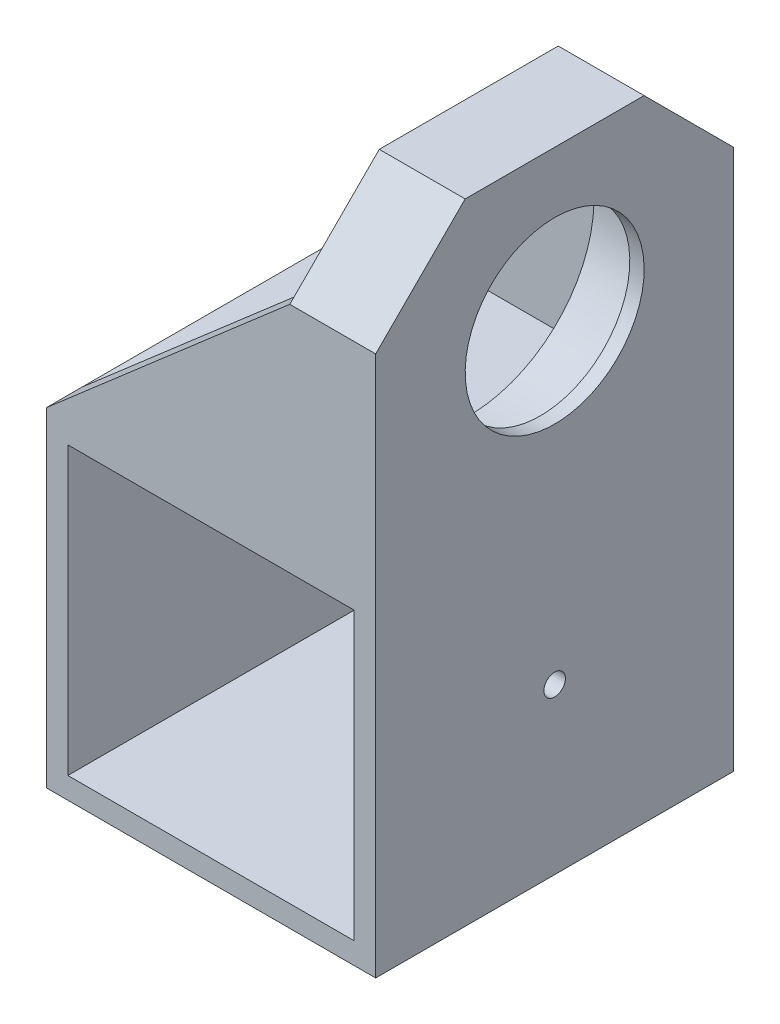
ISO-10303-21;
HEADER;
FILE_DESCRIPTION(('STEP AP214'),'2;1');
FILE_NAME('part.step','',(''),(''),'','','');
FILE_SCHEMA(('AUTOMOTIVE_DESIGN { 1 0 10303 214 1 1 1 1 }'));
ENDSEC;
DATA;
#1=APPLICATION_CONTEXT('core data for automotive mechanical design processes');
#2=APPLICATION_PROTOCOL_DEFINITION('international standard','automotive_design',2000,#1);
#3=PRODUCT_CONTEXT('',#1,'mechanical');
#4=PRODUCT('Part','Part','',(#3));
#5=PRODUCT_RELATED_PRODUCT_CATEGORY('part','',(#4));
#6=PRODUCT_DEFINITION_FORMATION('','',#4);
#7=PRODUCT_DEFINITION_CONTEXT('part definition',#1,'design');
#8=PRODUCT_DEFINITION('design','',#6,#7);
#9=PRODUCT_DEFINITION_SHAPE('','',#8);
#10=(LENGTH_UNIT() NAMED_UNIT(*) SI_UNIT(.MILLI.,.METRE.));
#11=(NAMED_UNIT(*) PLANE_ANGLE_UNIT() SI_UNIT($,.RADIAN.));
#12=(NAMED_UNIT(*) SI_UNIT($,.STERADIAN.) SOLID_ANGLE_UNIT());
#13=UNCERTAINTY_MEASURE_WITH_UNIT(LENGTH_MEASURE(1.E-05),#10,'distance_accuracy_value','');
#14=(GEOMETRIC_REPRESENTATION_CONTEXT(3) GLOBAL_UNCERTAINTY_ASSIGNED_CONTEXT((#13)) GLOBAL_UNIT_ASSIGNED_CONTEXT((#10,
#11,#12)) REPRESENTATION_CONTEXT('',''));
#15=CARTESIAN_POINT('',(0.,0.,0.));
#16=DIRECTION('',(0.,0.,1.));
#17=DIRECTION('',(1.,0.,0.));
#18=AXIS2_PLACEMENT_3D('',#15,#16,#17);
#19=CARTESIAN_POINT('',(-46.,46.,50.));
#20=DIRECTION('',(0.,-1.,0.));
#21=DIRECTION('',(0.,0.,-1.));
#22=AXIS2_PLACEMENT_3D('',#19,#20,#21);
#23=PLANE('',#22);
#24=DIRECTION('',(0.,0.,-1.));
#25=VECTOR('',#24,1.);
#26=CARTESIAN_POINT('',(-46.,46.,50.));
#27=LINE('',#26,#25);
#28=CARTESIAN_POINT('',(-46.,46.,45.));
#29=VERTEX_POINT('',#28);
#30=CARTESIAN_POINT('',(-46.,46.,5.));
#31=VERTEX_POINT('',#30);
#32=EDGE_CURVE('E273',#29,#31,#27,.T.);
#33=ORIENTED_EDGE('',*,*,#32,.F.);
#34=DIRECTION('',(1.,0.,0.));
#35=VECTOR('',#34,1.);
#36=CARTESIAN_POINT('',(-46.,46.,45.));
#37=LINE('',#36,#35);
#38=CARTESIAN_POINT('',(-12.,46.,45.));
#39=VERTEX_POINT('',#38);
#40=EDGE_CURVE('E155',#29,#39,#37,.T.);
#41=ORIENTED_EDGE('',*,*,#40,.T.);
#42=DIRECTION('',(0.,0.,-1.));
#43=VECTOR('',#42,1.);
#44=CARTESIAN_POINT('',(-12.,46.,50.));
#45=LINE('',#44,#43);
#46=CARTESIAN_POINT('',(-12.,46.,5.));
#47=VERTEX_POINT('',#46);
#48=EDGE_CURVE('E167',#39,#47,#45,.T.);
#49=ORIENTED_EDGE('',*,*,#48,.T.);
#50=DIRECTION('',(-1.,0.,0.));
#51=VECTOR('',#50,1.);
#52=CARTESIAN_POINT('',(-46.,46.,5.));
#53=LINE('',#52,#51);
#54=EDGE_CURVE('E174',#47,#31,#53,.T.);
#55=ORIENTED_EDGE('',*,*,#54,.T.);
#56=EDGE_LOOP('',(#33,#41,#49,#55));
#57=FACE_BOUND('',#56,.T.);
#58=ADVANCED_FACE('F41',(#57),#23,.F.);
#59=CARTESIAN_POINT('',(-12.,67.,25.));
#60=DIRECTION('',(1.,0.,0.));
#61=DIRECTION('',(0.,1.,0.));
#62=AXIS2_PLACEMENT_3D('',#59,#60,#61);
#63=CYLINDRICAL_SURFACE('',#62,17.5);
#64=CARTESIAN_POINT('',(-12.,67.,25.));
#65=DIRECTION('',(1.,0.,0.));
#66=DIRECTION('',(0.,1.,0.));
#67=AXIS2_PLACEMENT_3D('',#64,#65,#66);
#68=CIRCLE('',#67,17.5);
#69=CARTESIAN_POINT('',(-12.,84.5,25.));
#70=VERTEX_POINT('',#69);
#71=EDGE_CURVE('E191',#70,#70,#68,.T.);
#72=ORIENTED_EDGE('',*,*,#71,.F.);
#73=EDGE_LOOP('',(#72));
#74=FACE_BOUND('',#73,.T.);
#75=CARTESIAN_POINT('',(-2.,67.,25.));
#76=DIRECTION('',(1.,0.,0.));
#77=DIRECTION('',(0.,1.,0.));
#78=AXIS2_PLACEMENT_3D('',#75,#76,#77);
#79=CIRCLE('',#78,17.5);
#80=CARTESIAN_POINT('',(-2.,84.5,25.));
#81=VERTEX_POINT('',#80);
#82=EDGE_CURVE('E11',#81,#81,#79,.F.);
#83=ORIENTED_EDGE('',*,*,#82,.F.);
#84=EDGE_LOOP('',(#83));
#85=FACE_BOUND('',#84,.T.);
#86=ADVANCED_FACE('F323',(#74,#85),#63,.F.);
#87=CARTESIAN_POINT('',(0.,0.,50.));
#88=DIRECTION('',(0.,0.,1.));
#89=DIRECTION('',(1.,0.,0.));
#90=AXIS2_PLACEMENT_3D('',#87,#88,#89);
#91=PLANE('',#90);
#92=DIRECTION('',(-0.755322467302113,-0.65535331721801,0.));
#93=VECTOR('',#92,1.);
#94=CARTESIAN_POINT('',(-12.,75.5,50.));
#95=LINE('',#94,#93);
#96=CARTESIAN_POINT('',(-12.,75.5,50.));
#97=VERTEX_POINT('',#96);
#98=CARTESIAN_POINT('',(-46.,46.,50.));
#99=VERTEX_POINT('',#98);
#100=EDGE_CURVE('E149',#97,#99,#95,.T.);
#101=ORIENTED_EDGE('',*,*,#100,.T.);
#102=DIRECTION('',(0.,-1.,0.));
#103=VECTOR('',#102,1.);
#104=CARTESIAN_POINT('',(-46.,46.,50.));
#105=LINE('',#104,#103);
#106=CARTESIAN_POINT('',(-46.,0.,50.));
#107=VERTEX_POINT('',#106);
#108=EDGE_CURVE('E265',#99,#107,#105,.T.);
#109=ORIENTED_EDGE('',*,*,#108,.T.);
#110=DIRECTION('',(1.,0.,0.));
#111=VECTOR('',#110,1.);
#112=CARTESIAN_POINT('',(-46.,0.,50.));
#113=LINE('',#112,#111);
#114=CARTESIAN_POINT('',(0.,0.,50.));
#115=VERTEX_POINT('',#114);
#116=EDGE_CURVE('E268',#107,#115,#113,.T.);
#117=ORIENTED_EDGE('',*,*,#116,.T.);
#118=DIRECTION('',(0.,1.,0.));
#119=VECTOR('',#118,1.);
#120=CARTESIAN_POINT('',(0.,46.,50.));
#121=LINE('',#120,#119);
#122=CARTESIAN_POINT('',(0.,75.5,50.));
#123=VERTEX_POINT('',#122);
#124=EDGE_CURVE('E271',#115,#123,#121,.T.);
#125=ORIENTED_EDGE('',*,*,#124,.T.);
#126=DIRECTION('',(1.,0.,0.));
#127=VECTOR('',#126,1.);
#128=CARTESIAN_POINT('',(-12.,75.5,50.));
#129=LINE('',#128,#127);
#130=EDGE_CURVE('E222',#97,#123,#129,.T.);
#131=ORIENTED_EDGE('',*,*,#130,.F.);
#132=EDGE_LOOP('',(#101,#109,#117,#125,#131));
#133=FACE_BOUND('',#132,.T.);
#134=DIRECTION('',(1.,0.,0.));
#135=VECTOR('',#134,1.);
#136=CARTESIAN_POINT('',(-43.,3.,50.));
#137=LINE('',#136,#135);
#138=CARTESIAN_POINT('',(-43.,3.,50.));
#139=VERTEX_POINT('',#138);
#140=CARTESIAN_POINT('',(-3.,3.,50.));
#141=VERTEX_POINT('',#140);
#142=EDGE_CURVE('E241',#139,#141,#137,.T.);
#143=ORIENTED_EDGE('',*,*,#142,.F.);
#144=DIRECTION('',(0.,-1.,0.));
#145=VECTOR('',#144,1.);
#146=CARTESIAN_POINT('',(-43.,43.,50.));
#147=LINE('',#146,#145);
#148=CARTESIAN_POINT('',(-43.,43.,50.));
#149=VERTEX_POINT('',#148);
#150=EDGE_CURVE('E239',#149,#139,#147,.T.);
#151=ORIENTED_EDGE('',*,*,#150,.F.);
#152=DIRECTION('',(-1.,0.,0.));
#153=VECTOR('',#152,1.);
#154=CARTESIAN_POINT('',(-43.,43.,50.));
#155=LINE('',#154,#153);
#156=CARTESIAN_POINT('',(-3.00000000000001,43.,50.));
#157=VERTEX_POINT('',#156);
#158=EDGE_CURVE('E246',#157,#149,#155,.T.);
#159=ORIENTED_EDGE('',*,*,#158,.F.);
#160=DIRECTION('',(0.,1.,0.));
#161=VECTOR('',#160,1.);
#162=CARTESIAN_POINT('',(-3.00000000000001,43.,50.));
#163=LINE('',#162,#161);
#164=EDGE_CURVE('E244',#141,#157,#163,.T.);
#165=ORIENTED_EDGE('',*,*,#164,.F.);
#166=EDGE_LOOP('',(#143,#151,#159,#165));
#167=FACE_BOUND('',#166,.T.);
#168=ADVANCED_FACE('F310',(#133,#167),#91,.T.);
#169=CARTESIAN_POINT('',(0.,0.,0.));
#170=DIRECTION('',(0.,0.,1.));
#171=DIRECTION('',(1.,0.,0.));
#172=AXIS2_PLACEMENT_3D('',#169,#170,#171);
#173=PLANE('',#172);
#174=DIRECTION('',(0.,-1.,0.));
#175=VECTOR('',#174,1.);
#176=CARTESIAN_POINT('',(-46.,46.,0.));
#177=LINE('',#176,#175);
#178=CARTESIAN_POINT('',(-46.,46.,0.));
#179=VERTEX_POINT('',#178);
#180=CARTESIAN_POINT('',(-46.,0.,0.));
#181=VERTEX_POINT('',#180);
#182=EDGE_CURVE('E264',#179,#181,#177,.T.);
#183=ORIENTED_EDGE('',*,*,#182,.F.);
#184=DIRECTION('',(0.755322467302113,0.65535331721801,0.));
#185=VECTOR('',#184,1.);
#186=CARTESIAN_POINT('',(-12.,75.5,0.));
#187=LINE('',#186,#185);
#188=CARTESIAN_POINT('',(-12.,75.5,0.));
#189=VERTEX_POINT('',#188);
#190=EDGE_CURVE('E154',#179,#189,#187,.T.);
#191=ORIENTED_EDGE('',*,*,#190,.T.);
#192=DIRECTION('',(1.,0.,0.));
#193=VECTOR('',#192,1.);
#194=CARTESIAN_POINT('',(-12.,75.5,0.));
#195=LINE('',#194,#193);
#196=CARTESIAN_POINT('',(0.,75.5,0.));
#197=VERTEX_POINT('',#196);
#198=EDGE_CURVE('E219',#189,#197,#195,.T.);
#199=ORIENTED_EDGE('',*,*,#198,.T.);
#200=DIRECTION('',(0.,1.,0.));
#201=VECTOR('',#200,1.);
#202=CARTESIAN_POINT('',(0.,46.,0.));
#203=LINE('',#202,#201);
#204=CARTESIAN_POINT('',(0.,0.,0.));
#205=VERTEX_POINT('',#204);
#206=EDGE_CURVE('E269',#205,#197,#203,.T.);
#207=ORIENTED_EDGE('',*,*,#206,.F.);
#208=DIRECTION('',(1.,0.,0.));
#209=VECTOR('',#208,1.);
#210=CARTESIAN_POINT('',(-46.,0.,0.));
#211=LINE('',#210,#209);
#212=EDGE_CURVE('E276',#181,#205,#211,.T.);
#213=ORIENTED_EDGE('',*,*,#212,.F.);
#214=EDGE_LOOP('',(#183,#191,#199,#207,#213));
#215=FACE_BOUND('',#214,.T.);
#216=DIRECTION('',(0.,-1.,0.));
#217=VECTOR('',#216,1.);
#218=CARTESIAN_POINT('',(-43.,43.,0.));
#219=LINE('',#218,#217);
#220=CARTESIAN_POINT('',(-43.,43.,0.));
#221=VERTEX_POINT('',#220);
#222=CARTESIAN_POINT('',(-43.,3.,0.));
#223=VERTEX_POINT('',#222);
#224=EDGE_CURVE('E64',#221,#223,#219,.T.);
#225=ORIENTED_EDGE('',*,*,#224,.T.);
#226=DIRECTION('',(1.,0.,0.));
#227=VECTOR('',#226,1.);
#228=CARTESIAN_POINT('',(-43.,3.,0.));
#229=LINE('',#228,#227);
#230=CARTESIAN_POINT('',(-3.,3.,0.));
#231=VERTEX_POINT('',#230);
#232=EDGE_CURVE('E250',#223,#231,#229,.T.);
#233=ORIENTED_EDGE('',*,*,#232,.T.);
#234=DIRECTION('',(0.,1.,0.));
#235=VECTOR('',#234,1.);
#236=CARTESIAN_POINT('',(-3.00000000000001,43.,0.));
#237=LINE('',#236,#235);
#238=CARTESIAN_POINT('',(-3.00000000000001,43.,0.));
#239=VERTEX_POINT('',#238);
#240=EDGE_CURVE('E253',#231,#239,#237,.T.);
#241=ORIENTED_EDGE('',*,*,#240,.T.);
#242=DIRECTION('',(-1.,0.,0.));
#243=VECTOR('',#242,1.);
#244=CARTESIAN_POINT('',(-43.,43.,0.));
#245=LINE('',#244,#243);
#246=EDGE_CURVE('E242',#239,#221,#245,.T.);
#247=ORIENTED_EDGE('',*,*,#246,.T.);
#248=EDGE_LOOP('',(#225,#233,#241,#247));
#249=FACE_BOUND('',#248,.T.);
#250=ADVANCED_FACE('F306',(#215,#249),#173,.F.);
#251=CARTESIAN_POINT('',(-46.,46.,50.));
#252=DIRECTION('',(1.,0.,0.));
#253=DIRECTION('',(0.,0.,-1.));
#254=AXIS2_PLACEMENT_3D('',#251,#252,#253);
#255=PLANE('',#254);
#256=CARTESIAN_POINT('',(-46.,23.,25.));
#257=DIRECTION('',(-1.,0.,0.));
#258=DIRECTION('',(0.,0.,1.));
#259=AXIS2_PLACEMENT_3D('',#256,#257,#258);
#260=CIRCLE('',#259,1.5);
#261=CARTESIAN_POINT('',(-46.,23.,26.5));
#262=VERTEX_POINT('',#261);
#263=EDGE_CURVE('E233',#262,#262,#260,.T.);
#264=ORIENTED_EDGE('',*,*,#263,.F.);
#265=EDGE_LOOP('',(#264));
#266=FACE_BOUND('',#265,.T.);
#267=ORIENTED_EDGE('',*,*,#182,.T.);
#268=DIRECTION('',(0.,0.,-1.));
#269=VECTOR('',#268,1.);
#270=CARTESIAN_POINT('',(-46.,0.,50.));
#271=LINE('',#270,#269);
#272=EDGE_CURVE('E49',#107,#181,#271,.T.);
#273=ORIENTED_EDGE('',*,*,#272,.F.);
#274=ORIENTED_EDGE('',*,*,#108,.F.);
#275=EDGE_CURVE('E279',#99,#29,#27,.T.);
#276=ORIENTED_EDGE('',*,*,#275,.T.);
#277=ORIENTED_EDGE('',*,*,#32,.T.);
#278=DIRECTION('',(0.,0.,-1.));
#279=VECTOR('',#278,1.);
#280=CARTESIAN_POINT('',(-46.,46.,5.));
#281=LINE('',#280,#279);
#282=EDGE_CURVE('E180',#31,#179,#281,.T.);
#283=ORIENTED_EDGE('',*,*,#282,.T.);
#284=EDGE_LOOP('',(#267,#273,#274,#276,#277,#283));
#285=FACE_BOUND('',#284,.T.);
#286=ADVANCED_FACE('F43',(#266,#285),#255,.F.);
#287=CARTESIAN_POINT('',(-46.,0.,50.));
#288=DIRECTION('',(0.,1.,0.));
#289=DIRECTION('',(0.,0.,1.));
#290=AXIS2_PLACEMENT_3D('',#287,#288,#289);
#291=PLANE('',#290);
#292=CARTESIAN_POINT('',(-23.,0.,25.));
#293=DIRECTION('',(0.,-1.,0.));
#294=DIRECTION('',(0.,0.,-1.));
#295=AXIS2_PLACEMENT_3D('',#292,#293,#294);
#296=CIRCLE('',#295,1.5);
#297=CARTESIAN_POINT('',(-23.,0.,23.5));
#298=VERTEX_POINT('',#297);
#299=EDGE_CURVE('E218',#298,#298,#296,.T.);
#300=ORIENTED_EDGE('',*,*,#299,.F.);
#301=EDGE_LOOP('',(#300));
#302=FACE_BOUND('',#301,.T.);
#303=ORIENTED_EDGE('',*,*,#212,.T.);
#304=DIRECTION('',(0.,0.,-1.));
#305=VECTOR('',#304,1.);
#306=CARTESIAN_POINT('',(0.,0.,50.));
#307=LINE('',#306,#305);
#308=EDGE_CURVE('E282',#115,#205,#307,.T.);
#309=ORIENTED_EDGE('',*,*,#308,.F.);
#310=ORIENTED_EDGE('',*,*,#116,.F.);
#311=ORIENTED_EDGE('',*,*,#272,.T.);
#312=EDGE_LOOP('',(#303,#309,#310,#311));
#313=FACE_BOUND('',#312,.T.);
#314=ADVANCED_FACE('F336',(#302,#313),#291,.F.);
#315=CARTESIAN_POINT('',(0.,46.,50.));
#316=DIRECTION('',(-1.,0.,0.));
#317=DIRECTION('',(0.,-1.,0.));
#318=AXIS2_PLACEMENT_3D('',#315,#316,#317);
#319=PLANE('',#318);
#320=CARTESIAN_POINT('',(0.,23.,25.));
#321=DIRECTION('',(-1.,0.,0.));
#322=DIRECTION('',(0.,0.,1.));
#323=AXIS2_PLACEMENT_3D('',#320,#321,#322);
#324=CIRCLE('',#323,1.5);
#325=CARTESIAN_POINT('',(0.,23.,26.5));
#326=VERTEX_POINT('',#325);
#327=EDGE_CURVE('E229',#326,#326,#324,.T.);
#328=ORIENTED_EDGE('',*,*,#327,.T.);
#329=EDGE_LOOP('',(#328));
#330=FACE_BOUND('',#329,.T.);
#331=ORIENTED_EDGE('',*,*,#206,.T.);
#332=DIRECTION('',(0.,0.707106781186547,0.707106781186548));
#333=VECTOR('',#332,1.);
#334=CARTESIAN_POINT('',(0.,88.,12.5));
#335=LINE('',#334,#333);
#336=CARTESIAN_POINT('',(0.,88.,12.5));
#337=VERTEX_POINT('',#336);
#338=EDGE_CURVE('E201',#197,#337,#335,.T.);
#339=ORIENTED_EDGE('',*,*,#338,.T.);
#340=DIRECTION('',(0.,0.,1.));
#341=VECTOR('',#340,1.);
#342=CARTESIAN_POINT('',(0.,88.,37.5));
#343=LINE('',#342,#341);
#344=CARTESIAN_POINT('',(0.,88.,37.5));
#345=VERTEX_POINT('',#344);
#346=EDGE_CURVE('E196',#337,#345,#343,.T.);
#347=ORIENTED_EDGE('',*,*,#346,.T.);
#348=DIRECTION('',(0.,-0.707106781186547,0.707106781186547));
#349=VECTOR('',#348,1.);
#350=CARTESIAN_POINT('',(0.,75.5,50.));
#351=LINE('',#350,#349);
#352=EDGE_CURVE('E211',#345,#123,#351,.T.);
#353=ORIENTED_EDGE('',*,*,#352,.T.);
#354=ORIENTED_EDGE('',*,*,#124,.F.);
#355=ORIENTED_EDGE('',*,*,#308,.T.);
#356=EDGE_LOOP('',(#331,#339,#347,#353,#354,#355));
#357=FACE_BOUND('',#356,.T.);
#358=CARTESIAN_POINT('',(0.,67.,25.));
#359=DIRECTION('',(1.,0.,0.));
#360=DIRECTION('',(0.,1.,0.));
#361=AXIS2_PLACEMENT_3D('',#358,#359,#360);
#362=CIRCLE('',#361,12.5);
#363=CARTESIAN_POINT('',(0.,79.5,25.));
#364=VERTEX_POINT('',#363);
#365=EDGE_CURVE('E185',#364,#364,#362,.T.);
#366=ORIENTED_EDGE('',*,*,#365,.F.);
#367=EDGE_LOOP('',(#366));
#368=FACE_BOUND('',#367,.T.);
#369=ADVANCED_FACE('F334',(#330,#357,#368),#319,.F.);
#370=CARTESIAN_POINT('',(-43.,43.,50.));
#371=DIRECTION('',(1.,0.,0.));
#372=DIRECTION('',(0.,1.,0.));
#373=AXIS2_PLACEMENT_3D('',#370,#371,#372);
#374=PLANE('',#373);
#375=CARTESIAN_POINT('',(-43.,23.,25.));
#376=DIRECTION('',(1.,0.,0.));
#377=DIRECTION('',(0.,1.,0.));
#378=AXIS2_PLACEMENT_3D('',#375,#376,#377);
#379=CIRCLE('',#378,1.5);
#380=CARTESIAN_POINT('',(-43.,24.5,25.));
#381=VERTEX_POINT('',#380);
#382=EDGE_CURVE('E236',#381,#381,#379,.T.);
#383=ORIENTED_EDGE('',*,*,#382,.F.);
#384=EDGE_LOOP('',(#383));
#385=FACE_BOUND('',#384,.T.);
#386=ORIENTED_EDGE('',*,*,#224,.F.);
#387=DIRECTION('',(0.,0.,-1.));
#388=VECTOR('',#387,1.);
#389=CARTESIAN_POINT('',(-43.,43.,50.));
#390=LINE('',#389,#388);
#391=EDGE_CURVE('E248',#149,#221,#390,.T.);
#392=ORIENTED_EDGE('',*,*,#391,.F.);
#393=ORIENTED_EDGE('',*,*,#150,.T.);
#394=DIRECTION('',(0.,0.,-1.));
#395=VECTOR('',#394,1.);
#396=CARTESIAN_POINT('',(-43.,3.,50.));
#397=LINE('',#396,#395);
#398=EDGE_CURVE('E262',#139,#223,#397,.T.);
#399=ORIENTED_EDGE('',*,*,#398,.T.);
#400=EDGE_LOOP('',(#386,#392,#393,#399));
#401=FACE_BOUND('',#400,.T.);
#402=ADVANCED_FACE('F298',(#385,#401),#374,.T.);
#403=CARTESIAN_POINT('',(-43.,3.,50.));
#404=DIRECTION('',(0.,1.,0.));
#405=DIRECTION('',(0.,0.,1.));
#406=AXIS2_PLACEMENT_3D('',#403,#404,#405);
#407=PLANE('',#406);
#408=CARTESIAN_POINT('',(-23.,3.,25.));
#409=DIRECTION('',(0.,1.,0.));
#410=DIRECTION('',(0.,0.,1.));
#411=AXIS2_PLACEMENT_3D('',#408,#409,#410);
#412=CIRCLE('',#411,1.5);
#413=CARTESIAN_POINT('',(-23.,3.,26.5));
#414=VERTEX_POINT('',#413);
#415=EDGE_CURVE('E228',#414,#414,#412,.T.);
#416=ORIENTED_EDGE('',*,*,#415,.F.);
#417=EDGE_LOOP('',(#416));
#418=FACE_BOUND('',#417,.T.);
#419=ORIENTED_EDGE('',*,*,#232,.F.);
#420=ORIENTED_EDGE('',*,*,#398,.F.);
#421=ORIENTED_EDGE('',*,*,#142,.T.);
#422=DIRECTION('',(0.,0.,-1.));
#423=VECTOR('',#422,1.);
#424=CARTESIAN_POINT('',(-3.,3.,50.));
#425=LINE('',#424,#423);
#426=EDGE_CURVE('E260',#141,#231,#425,.T.);
#427=ORIENTED_EDGE('',*,*,#426,.T.);
#428=EDGE_LOOP('',(#419,#420,#421,#427));
#429=FACE_BOUND('',#428,.T.);
#430=ADVANCED_FACE('F294',(#418,#429),#407,.T.);
#431=CARTESIAN_POINT('',(-3.00000000000001,43.,50.));
#432=DIRECTION('',(-1.,0.,0.));
#433=DIRECTION('',(0.,-1.,0.));
#434=AXIS2_PLACEMENT_3D('',#431,#432,#433);
#435=PLANE('',#434);
#436=CARTESIAN_POINT('',(-3.,23.,25.));
#437=DIRECTION('',(-1.,0.,0.));
#438=DIRECTION('',(0.,-1.,0.));
#439=AXIS2_PLACEMENT_3D('',#436,#437,#438);
#440=CIRCLE('',#439,1.5);
#441=CARTESIAN_POINT('',(-3.,21.5,25.));
#442=VERTEX_POINT('',#441);
#443=EDGE_CURVE('E232',#442,#442,#440,.T.);
#444=ORIENTED_EDGE('',*,*,#443,.F.);
#445=EDGE_LOOP('',(#444));
#446=FACE_BOUND('',#445,.T.);
#447=ORIENTED_EDGE('',*,*,#240,.F.);
#448=ORIENTED_EDGE('',*,*,#426,.F.);
#449=ORIENTED_EDGE('',*,*,#164,.T.);
#450=DIRECTION('',(0.,0.,-1.));
#451=VECTOR('',#450,1.);
#452=CARTESIAN_POINT('',(-3.00000000000001,43.,50.));
#453=LINE('',#452,#451);
#454=EDGE_CURVE('E56',#157,#239,#453,.T.);
#455=ORIENTED_EDGE('',*,*,#454,.T.);
#456=EDGE_LOOP('',(#447,#448,#449,#455));
#457=FACE_BOUND('',#456,.T.);
#458=ADVANCED_FACE('F297',(#446,#457),#435,.T.);
#459=CARTESIAN_POINT('',(-43.,43.,50.));
#460=DIRECTION('',(0.,-1.,0.));
#461=DIRECTION('',(0.,0.,-1.));
#462=AXIS2_PLACEMENT_3D('',#459,#460,#461);
#463=PLANE('',#462);
#464=ORIENTED_EDGE('',*,*,#246,.F.);
#465=ORIENTED_EDGE('',*,*,#454,.F.);
#466=ORIENTED_EDGE('',*,*,#158,.T.);
#467=ORIENTED_EDGE('',*,*,#391,.T.);
#468=EDGE_LOOP('',(#464,#465,#466,#467));
#469=FACE_BOUND('',#468,.T.);
#470=ADVANCED_FACE('F307',(#469),#463,.T.);
#471=CARTESIAN_POINT('',(0.,23.,25.));
#472=DIRECTION('',(-1.,0.,0.));
#473=DIRECTION('',(0.,0.,1.));
#474=AXIS2_PLACEMENT_3D('',#471,#472,#473);
#475=CYLINDRICAL_SURFACE('',#474,1.5);
#476=ORIENTED_EDGE('',*,*,#443,.T.);
#477=EDGE_LOOP('',(#476));
#478=FACE_BOUND('',#477,.T.);
#479=ORIENTED_EDGE('',*,*,#327,.F.);
#480=EDGE_LOOP('',(#479));
#481=FACE_BOUND('',#480,.T.);
#482=ADVANCED_FACE('F319',(#478,#481),#475,.F.);
#483=ORIENTED_EDGE('',*,*,#382,.T.);
#484=EDGE_LOOP('',(#483));
#485=FACE_BOUND('',#484,.T.);
#486=ORIENTED_EDGE('',*,*,#263,.T.);
#487=EDGE_LOOP('',(#486));
#488=FACE_BOUND('',#487,.T.);
#489=ADVANCED_FACE('F405',(#485,#488),#475,.F.);
#490=CARTESIAN_POINT('',(-23.,13.5,25.));
#491=DIRECTION('',(0.,-1.,0.));
#492=DIRECTION('',(0.,0.,-1.));
#493=AXIS2_PLACEMENT_3D('',#490,#491,#492);
#494=CYLINDRICAL_SURFACE('',#493,1.5);
#495=ORIENTED_EDGE('',*,*,#415,.T.);
#496=EDGE_LOOP('',(#495));
#497=FACE_BOUND('',#496,.T.);
#498=ORIENTED_EDGE('',*,*,#299,.T.);
#499=EDGE_LOOP('',(#498));
#500=FACE_BOUND('',#499,.T.);
#501=ADVANCED_FACE('F291',(#497,#500),#494,.F.);
#502=CARTESIAN_POINT('',(-12.,88.,37.5));
#503=DIRECTION('',(0.,1.,0.));
#504=DIRECTION('',(-1.,0.,0.));
#505=AXIS2_PLACEMENT_3D('',#502,#503,#504);
#506=PLANE('',#505);
#507=ORIENTED_EDGE('',*,*,#346,.F.);
#508=DIRECTION('',(1.,0.,0.));
#509=VECTOR('',#508,1.);
#510=CARTESIAN_POINT('',(-12.,88.,12.5));
#511=LINE('',#510,#509);
#512=CARTESIAN_POINT('',(-12.,88.,12.5));
#513=VERTEX_POINT('',#512);
#514=EDGE_CURVE('E216',#513,#337,#511,.T.);
#515=ORIENTED_EDGE('',*,*,#514,.F.);
#516=DIRECTION('',(0.,0.,1.));
#517=VECTOR('',#516,1.);
#518=CARTESIAN_POINT('',(-12.,88.,37.5));
#519=LINE('',#518,#517);
#520=CARTESIAN_POINT('',(-12.,88.,37.5));
#521=VERTEX_POINT('',#520);
#522=EDGE_CURVE('E197',#513,#521,#519,.T.);
#523=ORIENTED_EDGE('',*,*,#522,.T.);
#524=DIRECTION('',(1.,0.,0.));
#525=VECTOR('',#524,1.);
#526=CARTESIAN_POINT('',(-12.,88.,37.5));
#527=LINE('',#526,#525);
#528=EDGE_CURVE('E208',#521,#345,#527,.T.);
#529=ORIENTED_EDGE('',*,*,#528,.T.);
#530=EDGE_LOOP('',(#507,#515,#523,#529));
#531=FACE_BOUND('',#530,.T.);
#532=ADVANCED_FACE('F362',(#531),#506,.T.);
#533=CARTESIAN_POINT('',(-12.,88.,12.5));
#534=DIRECTION('',(0.,0.707106781186548,-0.707106781186547));
#535=DIRECTION('',(0.,0.707106781186547,0.707106781186548));
#536=AXIS2_PLACEMENT_3D('',#533,#534,#535);
#537=PLANE('',#536);
#538=ORIENTED_EDGE('',*,*,#338,.F.);
#539=ORIENTED_EDGE('',*,*,#198,.F.);
#540=DIRECTION('',(0.,0.707106781186547,0.707106781186548));
#541=VECTOR('',#540,1.);
#542=CARTESIAN_POINT('',(-12.,88.,12.5));
#543=LINE('',#542,#541);
#544=EDGE_CURVE('E205',#189,#513,#543,.T.);
#545=ORIENTED_EDGE('',*,*,#544,.T.);
#546=ORIENTED_EDGE('',*,*,#514,.T.);
#547=EDGE_LOOP('',(#538,#539,#545,#546));
#548=FACE_BOUND('',#547,.T.);
#549=ADVANCED_FACE('F358',(#548),#537,.T.);
#550=CARTESIAN_POINT('',(-12.,75.5,50.));
#551=DIRECTION('',(0.,0.707106781186548,0.707106781186548));
#552=DIRECTION('',(0.,-0.707106781186548,0.707106781186548));
#553=AXIS2_PLACEMENT_3D('',#550,#551,#552);
#554=PLANE('',#553);
#555=ORIENTED_EDGE('',*,*,#352,.F.);
#556=ORIENTED_EDGE('',*,*,#528,.F.);
#557=DIRECTION('',(0.,-0.707106781186547,0.707106781186547));
#558=VECTOR('',#557,1.);
#559=CARTESIAN_POINT('',(-12.,75.5,50.));
#560=LINE('',#559,#558);
#561=EDGE_CURVE('E200',#521,#97,#560,.T.);
#562=ORIENTED_EDGE('',*,*,#561,.T.);
#563=ORIENTED_EDGE('',*,*,#130,.T.);
#564=EDGE_LOOP('',(#555,#556,#562,#563));
#565=FACE_BOUND('',#564,.T.);
#566=ADVANCED_FACE('F365',(#565),#554,.T.);
#567=CARTESIAN_POINT('',(-12.,0.,0.));
#568=DIRECTION('',(-1.,0.,0.));
#569=DIRECTION('',(0.,-1.,0.));
#570=AXIS2_PLACEMENT_3D('',#567,#568,#569);
#571=PLANE('',#570);
#572=DIRECTION('',(0.,0.,1.));
#573=VECTOR('',#572,1.);
#574=CARTESIAN_POINT('',(-12.,75.5,45.));
#575=LINE('',#574,#573);
#576=CARTESIAN_POINT('',(-12.,75.5,45.));
#577=VERTEX_POINT('',#576);
#578=EDGE_CURVE('E143',#577,#97,#575,.T.);
#579=ORIENTED_EDGE('',*,*,#578,.T.);
#580=ORIENTED_EDGE('',*,*,#561,.F.);
#581=ORIENTED_EDGE('',*,*,#522,.F.);
#582=ORIENTED_EDGE('',*,*,#544,.F.);
#583=DIRECTION('',(0.,0.,-1.));
#584=VECTOR('',#583,1.);
#585=CARTESIAN_POINT('',(-12.,75.5,5.));
#586=LINE('',#585,#584);
#587=CARTESIAN_POINT('',(-12.,75.5,5.));
#588=VERTEX_POINT('',#587);
#589=EDGE_CURVE('E182',#588,#189,#586,.T.);
#590=ORIENTED_EDGE('',*,*,#589,.F.);
#591=DIRECTION('',(0.,-1.,0.));
#592=VECTOR('',#591,1.);
#593=CARTESIAN_POINT('',(-12.,46.,5.));
#594=LINE('',#593,#592);
#595=EDGE_CURVE('E172',#588,#47,#594,.T.);
#596=ORIENTED_EDGE('',*,*,#595,.T.);
#597=ORIENTED_EDGE('',*,*,#48,.F.);
#598=DIRECTION('',(0.,1.,0.));
#599=VECTOR('',#598,1.);
#600=CARTESIAN_POINT('',(-12.,46.,45.));
#601=LINE('',#600,#599);
#602=EDGE_CURVE('E159',#39,#577,#601,.T.);
#603=ORIENTED_EDGE('',*,*,#602,.T.);
#604=EDGE_LOOP('',(#579,#580,#581,#582,#590,#596,#597,#603));
#605=FACE_BOUND('',#604,.T.);
#606=ORIENTED_EDGE('',*,*,#71,.T.);
#607=EDGE_LOOP('',(#606));
#608=FACE_BOUND('',#607,.T.);
#609=ADVANCED_FACE('F164',(#605,#608),#571,.T.);
#610=CARTESIAN_POINT('',(-2.,67.,25.));
#611=DIRECTION('',(1.,0.,0.));
#612=DIRECTION('',(0.,1.,0.));
#613=AXIS2_PLACEMENT_3D('',#610,#611,#612);
#614=PLANE('',#613);
#615=CARTESIAN_POINT('',(-2.,67.,25.));
#616=DIRECTION('',(1.,0.,0.));
#617=DIRECTION('',(0.,1.,0.));
#618=AXIS2_PLACEMENT_3D('',#615,#616,#617);
#619=CIRCLE('',#618,12.5);
#620=CARTESIAN_POINT('',(-2.,79.5,25.));
#621=VERTEX_POINT('',#620);
#622=EDGE_CURVE('E188',#621,#621,#619,.T.);
#623=ORIENTED_EDGE('',*,*,#622,.T.);
#624=EDGE_LOOP('',(#623));
#625=FACE_BOUND('',#624,.T.);
#626=ORIENTED_EDGE('',*,*,#82,.T.);
#627=EDGE_LOOP('',(#626));
#628=FACE_BOUND('',#627,.T.);
#629=ADVANCED_FACE('F390',(#625,#628),#614,.F.);
#630=CARTESIAN_POINT('',(-2.,67.,25.));
#631=DIRECTION('',(1.,0.,0.));
#632=DIRECTION('',(0.,1.,0.));
#633=AXIS2_PLACEMENT_3D('',#630,#631,#632);
#634=CYLINDRICAL_SURFACE('',#633,12.5);
#635=ORIENTED_EDGE('',*,*,#622,.F.);
#636=EDGE_LOOP('',(#635));
#637=FACE_BOUND('',#636,.T.);
#638=ORIENTED_EDGE('',*,*,#365,.T.);
#639=EDGE_LOOP('',(#638));
#640=FACE_BOUND('',#639,.T.);
#641=ADVANCED_FACE('F384',(#637,#640),#634,.F.);
#642=CARTESIAN_POINT('',(-12.,75.5,5.));
#643=DIRECTION('',(-0.65535331721801,0.755322467302113,0.));
#644=DIRECTION('',(-0.755322467302113,-0.65535331721801,0.));
#645=AXIS2_PLACEMENT_3D('',#642,#643,#644);
#646=PLANE('',#645);
#647=ORIENTED_EDGE('',*,*,#190,.F.);
#648=ORIENTED_EDGE('',*,*,#282,.F.);
#649=DIRECTION('',(0.755322467302113,0.65535331721801,0.));
#650=VECTOR('',#649,1.);
#651=CARTESIAN_POINT('',(-12.,75.5,5.));
#652=LINE('',#651,#650);
#653=EDGE_CURVE('E177',#31,#588,#652,.T.);
#654=ORIENTED_EDGE('',*,*,#653,.T.);
#655=ORIENTED_EDGE('',*,*,#589,.T.);
#656=EDGE_LOOP('',(#647,#648,#654,#655));
#657=FACE_BOUND('',#656,.T.);
#658=ADVANCED_FACE('F372',(#657),#646,.T.);
#659=CARTESIAN_POINT('',(0.,0.,5.));
#660=DIRECTION('',(0.,0.,-1.));
#661=DIRECTION('',(-1.,0.,0.));
#662=AXIS2_PLACEMENT_3D('',#659,#660,#661);
#663=PLANE('',#662);
#664=ORIENTED_EDGE('',*,*,#595,.F.);
#665=ORIENTED_EDGE('',*,*,#653,.F.);
#666=ORIENTED_EDGE('',*,*,#54,.F.);
#667=EDGE_LOOP('',(#664,#665,#666));
#668=FACE_BOUND('',#667,.T.);
#669=ADVANCED_FACE('F376',(#668),#663,.F.);
#670=CARTESIAN_POINT('',(-12.,75.5,45.));
#671=DIRECTION('',(-0.65535331721801,0.755322467302113,0.));
#672=DIRECTION('',(-0.755322467302113,-0.65535331721801,0.));
#673=AXIS2_PLACEMENT_3D('',#670,#671,#672);
#674=PLANE('',#673);
#675=ORIENTED_EDGE('',*,*,#100,.F.);
#676=ORIENTED_EDGE('',*,*,#578,.F.);
#677=DIRECTION('',(-0.755322467302113,-0.65535331721801,0.));
#678=VECTOR('',#677,1.);
#679=CARTESIAN_POINT('',(-12.,75.5,45.));
#680=LINE('',#679,#678);
#681=EDGE_CURVE('E146',#577,#29,#680,.T.);
#682=ORIENTED_EDGE('',*,*,#681,.T.);
#683=ORIENTED_EDGE('',*,*,#275,.F.);
#684=EDGE_LOOP('',(#675,#676,#682,#683));
#685=FACE_BOUND('',#684,.T.);
#686=ADVANCED_FACE('F145',(#685),#674,.T.);
#687=CARTESIAN_POINT('',(0.,0.,45.));
#688=DIRECTION('',(0.,0.,-1.));
#689=DIRECTION('',(-1.,0.,0.));
#690=AXIS2_PLACEMENT_3D('',#687,#688,#689);
#691=PLANE('',#690);
#692=ORIENTED_EDGE('',*,*,#602,.F.);
#693=ORIENTED_EDGE('',*,*,#40,.F.);
#694=ORIENTED_EDGE('',*,*,#681,.F.);
#695=EDGE_LOOP('',(#692,#693,#694));
#696=FACE_BOUND('',#695,.T.);
#697=ADVANCED_FACE('F158',(#696),#691,.T.);
#698=CLOSED_SHELL('',(#58,#86,#168,#250,#286,#314,#369,#402,#430,#458,#470,#482,#489,#501,#532,
#549,#566,#609,#629,#641,#658,#669,#686,#697));
#699=MANIFOLD_SOLID_BREP('B2',#698);
#700=ADVANCED_BREP_SHAPE_REPRESENTATION('',(#18,#699),#14);
#701=SHAPE_DEFINITION_REPRESENTATION(#9,#700);
ENDSEC;
END-ISO-10303-21;
